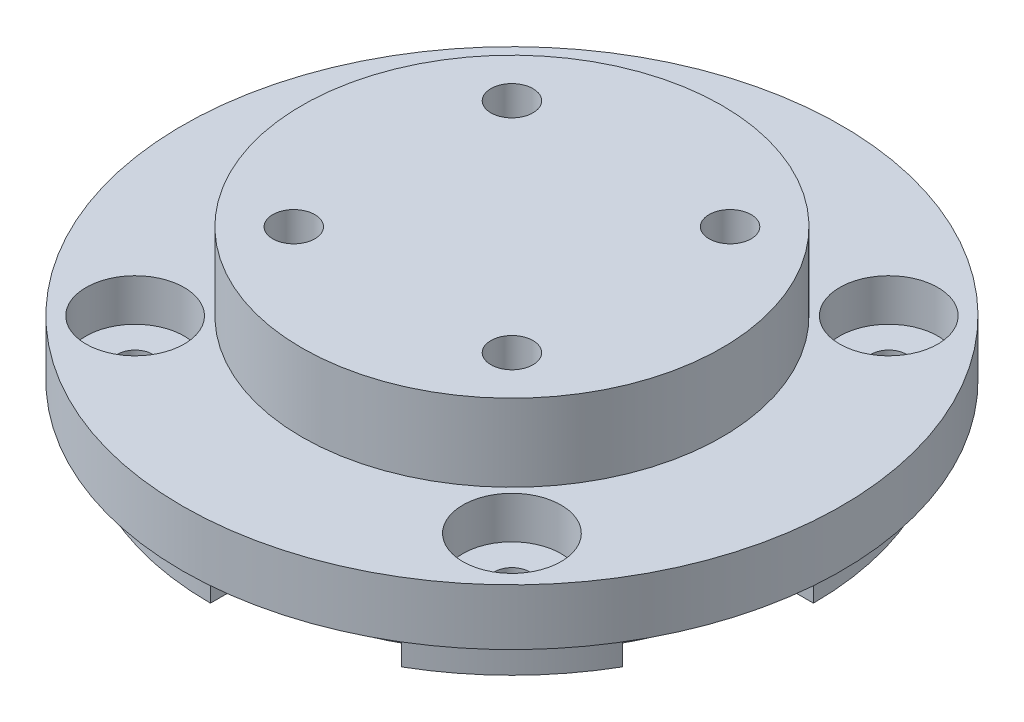
ISO-10303-21;
HEADER;
FILE_DESCRIPTION(('STEP AP214'),'2;1');
FILE_NAME('part.step','',(''),(''),'','','');
FILE_SCHEMA(('AUTOMOTIVE_DESIGN { 1 0 10303 214 1 1 1 1 }'));
ENDSEC;
DATA;
#1=APPLICATION_CONTEXT('core data for automotive mechanical design processes');
#2=APPLICATION_PROTOCOL_DEFINITION('international standard','automotive_design',2000,#1);
#3=PRODUCT_CONTEXT('',#1,'mechanical');
#4=PRODUCT('Part','Part','',(#3));
#5=PRODUCT_RELATED_PRODUCT_CATEGORY('part','',(#4));
#6=PRODUCT_DEFINITION_FORMATION('','',#4);
#7=PRODUCT_DEFINITION_CONTEXT('part definition',#1,'design');
#8=PRODUCT_DEFINITION('design','',#6,#7);
#9=PRODUCT_DEFINITION_SHAPE('','',#8);
#10=(LENGTH_UNIT() NAMED_UNIT(*) SI_UNIT(.MILLI.,.METRE.));
#11=(NAMED_UNIT(*) PLANE_ANGLE_UNIT() SI_UNIT($,.RADIAN.));
#12=(NAMED_UNIT(*) SI_UNIT($,.STERADIAN.) SOLID_ANGLE_UNIT());
#13=UNCERTAINTY_MEASURE_WITH_UNIT(LENGTH_MEASURE(1.E-05),#10,'distance_accuracy_value','');
#14=(GEOMETRIC_REPRESENTATION_CONTEXT(3) GLOBAL_UNCERTAINTY_ASSIGNED_CONTEXT((#13)) GLOBAL_UNIT_ASSIGNED_CONTEXT((#10,
#11,#12)) REPRESENTATION_CONTEXT('',''));
#15=CARTESIAN_POINT('',(0.,0.,0.));
#16=DIRECTION('',(0.,0.,1.));
#17=DIRECTION('',(1.,0.,0.));
#18=AXIS2_PLACEMENT_3D('',#15,#16,#17);
#19=CARTESIAN_POINT('',(0.,7.,0.));
#20=DIRECTION('',(0.,-1.,0.));
#21=DIRECTION('',(0.,0.,-1.));
#22=AXIS2_PLACEMENT_3D('',#19,#20,#21);
#23=CYLINDRICAL_SURFACE('',#22,21.5);
#24=DIRECTION('',(0.,-1.,0.));
#25=VECTOR('',#24,1.);
#26=CARTESIAN_POINT('',(18.6195461813654,14.6977646978707,10.75));
#27=LINE('',#26,#25);
#28=CARTESIAN_POINT('',(18.6195461813654,3.,10.75));
#29=VERTEX_POINT('',#28);
#30=CARTESIAN_POINT('',(18.6195461813654,0.,10.75));
#31=VERTEX_POINT('',#30);
#32=EDGE_CURVE('E122',#29,#31,#27,.T.);
#33=ORIENTED_EDGE('',*,*,#32,.F.);
#34=CARTESIAN_POINT('',(0.,3.,0.));
#35=DIRECTION('',(0.,1.,0.));
#36=DIRECTION('',(0.,0.,1.));
#37=AXIS2_PLACEMENT_3D('',#34,#35,#36);
#38=CIRCLE('',#37,21.5);
#39=CARTESIAN_POINT('',(10.7499999999999,3.,18.6195461813655));
#40=VERTEX_POINT('',#39);
#41=EDGE_CURVE('E11',#40,#29,#38,.T.);
#42=ORIENTED_EDGE('',*,*,#41,.F.);
#43=DIRECTION('',(0.,-1.,0.));
#44=VECTOR('',#43,1.);
#45=CARTESIAN_POINT('',(10.7499999999999,14.6977646978707,18.6195461813655));
#46=LINE('',#45,#44);
#47=CARTESIAN_POINT('',(10.7499999999999,0.,18.6195461813655));
#48=VERTEX_POINT('',#47);
#49=EDGE_CURVE('E158',#40,#48,#46,.T.);
#50=ORIENTED_EDGE('',*,*,#49,.T.);
#51=CARTESIAN_POINT('',(0.,0.,0.));
#52=DIRECTION('',(0.,1.,0.));
#53=DIRECTION('',(0.,0.,1.));
#54=AXIS2_PLACEMENT_3D('',#51,#52,#53);
#55=CIRCLE('',#54,21.5);
#56=EDGE_CURVE('E222',#48,#31,#55,.T.);
#57=ORIENTED_EDGE('',*,*,#56,.T.);
#58=EDGE_LOOP('',(#33,#42,#50,#57));
#59=FACE_BOUND('',#58,.T.);
#60=ADVANCED_FACE('F43',(#59),#23,.T.);
#61=CARTESIAN_POINT('',(21.5,3.,0.));
#62=VERTEX_POINT('',#61);
#63=CARTESIAN_POINT('',(0.,3.,21.5));
#64=VERTEX_POINT('',#63);
#65=EDGE_CURVE('E51',#62,#64,#38,.T.);
#66=ORIENTED_EDGE('',*,*,#65,.F.);
#67=DIRECTION('',(0.,-1.,0.));
#68=VECTOR('',#67,1.);
#69=CARTESIAN_POINT('',(21.5,14.6977646978707,0.));
#70=LINE('',#69,#68);
#71=CARTESIAN_POINT('',(21.5,0.,0.));
#72=VERTEX_POINT('',#71);
#73=EDGE_CURVE('E141',#62,#72,#70,.T.);
#74=ORIENTED_EDGE('',*,*,#73,.T.);
#75=CARTESIAN_POINT('',(0.,0.,21.5));
#76=VERTEX_POINT('',#75);
#77=EDGE_CURVE('E218',#72,#76,#55,.T.);
#78=ORIENTED_EDGE('',*,*,#77,.T.);
#79=DIRECTION('',(0.,-1.,0.));
#80=VECTOR('',#79,1.);
#81=CARTESIAN_POINT('',(0.,14.6977646978707,21.5));
#82=LINE('',#81,#80);
#83=EDGE_CURVE('E153',#64,#76,#82,.T.);
#84=ORIENTED_EDGE('',*,*,#83,.F.);
#85=EDGE_LOOP('',(#66,#74,#78,#84));
#86=FACE_BOUND('',#85,.T.);
#87=ADVANCED_FACE('F249',(#86),#23,.T.);
#88=CARTESIAN_POINT('',(0.,0.,0.));
#89=DIRECTION('',(0.,1.,0.));
#90=DIRECTION('',(0.,0.,1.));
#91=AXIS2_PLACEMENT_3D('',#88,#89,#90);
#92=PLANE('',#91);
#93=CARTESIAN_POINT('',(0.,0.,0.));
#94=DIRECTION('',(0.,1.,0.));
#95=DIRECTION('',(0.,0.,1.));
#96=AXIS2_PLACEMENT_3D('',#93,#94,#95);
#97=CIRCLE('',#96,14.48);
#98=CARTESIAN_POINT('',(0.,0.,14.48));
#99=VERTEX_POINT('',#98);
#100=EDGE_CURVE('E565',#99,#99,#97,.T.);
#101=ORIENTED_EDGE('',*,*,#100,.T.);
#102=EDGE_LOOP('',(#101));
#103=FACE_BOUND('',#102,.T.);
#104=CARTESIAN_POINT('',(13.4350288425444,0.,-13.4350288425444));
#105=DIRECTION('',(0.,1.,0.));
#106=DIRECTION('',(0.,0.,1.));
#107=AXIS2_PLACEMENT_3D('',#104,#105,#106);
#108=CIRCLE('',#107,1.25);
#109=CARTESIAN_POINT('',(13.4350288425444,0.,-12.1850288425444));
#110=VERTEX_POINT('',#109);
#111=EDGE_CURVE('E198',#110,#110,#108,.T.);
#112=ORIENTED_EDGE('',*,*,#111,.T.);
#113=EDGE_LOOP('',(#112));
#114=FACE_BOUND('',#113,.T.);
#115=CARTESIAN_POINT('',(13.4350288425444,0.,13.4350288425444));
#116=DIRECTION('',(0.,1.,0.));
#117=DIRECTION('',(0.,0.,1.));
#118=AXIS2_PLACEMENT_3D('',#115,#116,#117);
#119=CIRCLE('',#118,1.25);
#120=CARTESIAN_POINT('',(13.4350288425444,0.,14.6850288425444));
#121=VERTEX_POINT('',#120);
#122=EDGE_CURVE('E207',#121,#121,#119,.T.);
#123=ORIENTED_EDGE('',*,*,#122,.T.);
#124=EDGE_LOOP('',(#123));
#125=FACE_BOUND('',#124,.T.);
#126=CARTESIAN_POINT('',(-13.4350288425444,0.,13.4350288425444));
#127=DIRECTION('',(0.,1.,0.));
#128=DIRECTION('',(0.,0.,1.));
#129=AXIS2_PLACEMENT_3D('',#126,#127,#128);
#130=CIRCLE('',#129,1.25);
#131=CARTESIAN_POINT('',(-13.4350288425444,0.,14.6850288425444));
#132=VERTEX_POINT('',#131);
#133=EDGE_CURVE('E209',#132,#132,#130,.T.);
#134=ORIENTED_EDGE('',*,*,#133,.T.);
#135=EDGE_LOOP('',(#134));
#136=FACE_BOUND('',#135,.T.);
#137=CARTESIAN_POINT('',(-13.4350288425444,0.,-13.4350288425444));
#138=DIRECTION('',(0.,1.,0.));
#139=DIRECTION('',(0.,0.,1.));
#140=AXIS2_PLACEMENT_3D('',#137,#138,#139);
#141=CIRCLE('',#140,1.25);
#142=CARTESIAN_POINT('',(-13.4350288425444,0.,-12.1850288425444));
#143=VERTEX_POINT('',#142);
#144=EDGE_CURVE('E215',#143,#143,#141,.T.);
#145=ORIENTED_EDGE('',*,*,#144,.T.);
#146=EDGE_LOOP('',(#145));
#147=FACE_BOUND('',#146,.T.);
#148=ORIENTED_EDGE('',*,*,#77,.F.);
#149=DIRECTION('',(1.,0.,0.));
#150=VECTOR('',#149,1.);
#151=CARTESIAN_POINT('',(0.,0.,0.));
#152=LINE('',#151,#150);
#153=CARTESIAN_POINT('',(19.5,0.,0.));
#154=VERTEX_POINT('',#153);
#155=EDGE_CURVE('E135',#154,#72,#152,.T.);
#156=ORIENTED_EDGE('',*,*,#155,.F.);
#157=CARTESIAN_POINT('',(0.,0.,0.));
#158=DIRECTION('',(0.,-1.,0.));
#159=DIRECTION('',(0.,0.,-1.));
#160=AXIS2_PLACEMENT_3D('',#157,#158,#159);
#161=CIRCLE('',#160,19.5);
#162=CARTESIAN_POINT('',(16.8874953737965,0.,9.75000000000002));
#163=VERTEX_POINT('',#162);
#164=EDGE_CURVE('E114',#154,#163,#161,.T.);
#165=ORIENTED_EDGE('',*,*,#164,.T.);
#166=DIRECTION('',(0.866025403784438,0.,0.500000000000001));
#167=VECTOR('',#166,1.);
#168=CARTESIAN_POINT('',(0.,0.,0.));
#169=LINE('',#168,#167);
#170=EDGE_CURVE('E119',#163,#31,#169,.T.);
#171=ORIENTED_EDGE('',*,*,#170,.T.);
#172=ORIENTED_EDGE('',*,*,#56,.F.);
#173=DIRECTION('',(-0.499999999999995,0.,-0.866025403784442));
#174=VECTOR('',#173,1.);
#175=CARTESIAN_POINT('',(0.,0.,0.));
#176=LINE('',#175,#174);
#177=CARTESIAN_POINT('',(9.7499999999999,0.,16.8874953737966));
#178=VERTEX_POINT('',#177);
#179=EDGE_CURVE('E156',#48,#178,#176,.T.);
#180=ORIENTED_EDGE('',*,*,#179,.T.);
#181=CARTESIAN_POINT('',(0.,0.,0.));
#182=DIRECTION('',(0.,-1.,0.));
#183=DIRECTION('',(0.,0.,-1.));
#184=AXIS2_PLACEMENT_3D('',#181,#182,#183);
#185=CIRCLE('',#184,19.5);
#186=CARTESIAN_POINT('',(0.,0.,19.5));
#187=VERTEX_POINT('',#186);
#188=EDGE_CURVE('E159',#178,#187,#185,.T.);
#189=ORIENTED_EDGE('',*,*,#188,.T.);
#190=DIRECTION('',(0.,0.,1.));
#191=VECTOR('',#190,1.);
#192=CARTESIAN_POINT('',(0.,0.,0.));
#193=LINE('',#192,#191);
#194=EDGE_CURVE('E154',#187,#76,#193,.T.);
#195=ORIENTED_EDGE('',*,*,#194,.T.);
#196=EDGE_LOOP('',(#148,#156,#165,#171,#172,#180,#189,#195));
#197=FACE_BOUND('',#196,.T.);
#198=ADVANCED_FACE('F131',(#103,#114,#125,#136,#147,#197),#92,.F.);
#199=CARTESIAN_POINT('',(13.4350288425444,-8.,-13.4350288425444));
#200=DIRECTION('',(0.,1.,0.));
#201=DIRECTION('',(0.,0.,1.));
#202=AXIS2_PLACEMENT_3D('',#199,#200,#201);
#203=CYLINDRICAL_SURFACE('',#202,1.25);
#204=ORIENTED_EDGE('',*,*,#111,.F.);
#205=EDGE_LOOP('',(#204));
#206=FACE_BOUND('',#205,.T.);
#207=CARTESIAN_POINT('',(13.4350288425444,4.,-13.4350288425444));
#208=DIRECTION('',(0.,1.,0.));
#209=DIRECTION('',(0.,0.,1.));
#210=AXIS2_PLACEMENT_3D('',#207,#208,#209);
#211=CIRCLE('',#210,1.25);
#212=CARTESIAN_POINT('',(13.4350288425444,4.,-12.1850288425444));
#213=VERTEX_POINT('',#212);
#214=EDGE_CURVE('E202',#213,#213,#211,.F.);
#215=ORIENTED_EDGE('',*,*,#214,.F.);
#216=EDGE_LOOP('',(#215));
#217=FACE_BOUND('',#216,.T.);
#218=ADVANCED_FACE('F240',(#206,#217),#203,.F.);
#219=CARTESIAN_POINT('',(13.4350288425444,-8.,13.4350288425444));
#220=DIRECTION('',(0.,1.,0.));
#221=DIRECTION('',(0.,0.,1.));
#222=AXIS2_PLACEMENT_3D('',#219,#220,#221);
#223=CYLINDRICAL_SURFACE('',#222,1.25);
#224=ORIENTED_EDGE('',*,*,#122,.F.);
#225=EDGE_LOOP('',(#224));
#226=FACE_BOUND('',#225,.T.);
#227=CARTESIAN_POINT('',(13.4350288425444,4.,13.4350288425444));
#228=DIRECTION('',(0.,1.,0.));
#229=DIRECTION('',(0.,0.,1.));
#230=AXIS2_PLACEMENT_3D('',#227,#228,#229);
#231=CIRCLE('',#230,1.25);
#232=CARTESIAN_POINT('',(13.4350288425444,4.,14.6850288425444));
#233=VERTEX_POINT('',#232);
#234=EDGE_CURVE('E229',#233,#233,#231,.F.);
#235=ORIENTED_EDGE('',*,*,#234,.F.);
#236=EDGE_LOOP('',(#235));
#237=FACE_BOUND('',#236,.T.);
#238=ADVANCED_FACE('F237',(#226,#237),#223,.F.);
#239=CARTESIAN_POINT('',(-13.4350288425444,-8.,13.4350288425444));
#240=DIRECTION('',(0.,1.,0.));
#241=DIRECTION('',(0.,0.,1.));
#242=AXIS2_PLACEMENT_3D('',#239,#240,#241);
#243=CYLINDRICAL_SURFACE('',#242,1.25);
#244=ORIENTED_EDGE('',*,*,#133,.F.);
#245=EDGE_LOOP('',(#244));
#246=FACE_BOUND('',#245,.T.);
#247=CARTESIAN_POINT('',(-13.4350288425444,4.,13.4350288425444));
#248=DIRECTION('',(0.,1.,0.));
#249=DIRECTION('',(0.,0.,1.));
#250=AXIS2_PLACEMENT_3D('',#247,#248,#249);
#251=CIRCLE('',#250,1.25);
#252=CARTESIAN_POINT('',(-13.4350288425444,4.,14.6850288425444));
#253=VERTEX_POINT('',#252);
#254=EDGE_CURVE('E227',#253,#253,#251,.F.);
#255=ORIENTED_EDGE('',*,*,#254,.F.);
#256=EDGE_LOOP('',(#255));
#257=FACE_BOUND('',#256,.T.);
#258=ADVANCED_FACE('F246',(#246,#257),#243,.F.);
#259=CARTESIAN_POINT('',(-13.4350288425444,-8.,-13.4350288425444));
#260=DIRECTION('',(0.,1.,0.));
#261=DIRECTION('',(0.,0.,1.));
#262=AXIS2_PLACEMENT_3D('',#259,#260,#261);
#263=CYLINDRICAL_SURFACE('',#262,1.25);
#264=ORIENTED_EDGE('',*,*,#144,.F.);
#265=EDGE_LOOP('',(#264));
#266=FACE_BOUND('',#265,.T.);
#267=CARTESIAN_POINT('',(-13.4350288425444,4.,-13.4350288425444));
#268=DIRECTION('',(0.,1.,0.));
#269=DIRECTION('',(0.,0.,1.));
#270=AXIS2_PLACEMENT_3D('',#267,#268,#269);
#271=CIRCLE('',#270,1.25);
#272=CARTESIAN_POINT('',(-13.4350288425444,4.,-12.1850288425444));
#273=VERTEX_POINT('',#272);
#274=EDGE_CURVE('E192',#273,#273,#271,.F.);
#275=ORIENTED_EDGE('',*,*,#274,.F.);
#276=EDGE_LOOP('',(#275));
#277=FACE_BOUND('',#276,.T.);
#278=ADVANCED_FACE('F328',(#266,#277),#263,.F.);
#279=CARTESIAN_POINT('',(0.,3.,0.));
#280=DIRECTION('',(0.,1.,0.));
#281=DIRECTION('',(0.,0.,1.));
#282=AXIS2_PLACEMENT_3D('',#279,#280,#281);
#283=CYLINDRICAL_SURFACE('',#282,23.5);
#284=CARTESIAN_POINT('',(0.,3.,0.));
#285=DIRECTION('',(0.,1.,0.));
#286=DIRECTION('',(0.,0.,1.));
#287=AXIS2_PLACEMENT_3D('',#284,#285,#286);
#288=CIRCLE('',#287,23.5);
#289=CARTESIAN_POINT('',(0.,3.,23.5));
#290=VERTEX_POINT('',#289);
#291=EDGE_CURVE('E219',#290,#290,#288,.T.);
#292=ORIENTED_EDGE('',*,*,#291,.T.);
#293=EDGE_LOOP('',(#292));
#294=FACE_BOUND('',#293,.T.);
#295=CARTESIAN_POINT('',(0.,7.,0.));
#296=DIRECTION('',(0.,1.,0.));
#297=DIRECTION('',(0.,0.,1.));
#298=AXIS2_PLACEMENT_3D('',#295,#296,#297);
#299=CIRCLE('',#298,23.5);
#300=CARTESIAN_POINT('',(0.,7.,23.5));
#301=VERTEX_POINT('',#300);
#302=EDGE_CURVE('E214',#301,#301,#299,.T.);
#303=ORIENTED_EDGE('',*,*,#302,.F.);
#304=EDGE_LOOP('',(#303));
#305=FACE_BOUND('',#304,.T.);
#306=ADVANCED_FACE('F335',(#294,#305),#283,.T.);
#307=CARTESIAN_POINT('',(0.,3.,0.));
#308=DIRECTION('',(0.,1.,0.));
#309=DIRECTION('',(0.,0.,1.));
#310=AXIS2_PLACEMENT_3D('',#307,#308,#309);
#311=PLANE('',#310);
#312=ORIENTED_EDGE('',*,*,#65,.T.);
#313=DIRECTION('',(0.,0.,1.));
#314=VECTOR('',#313,1.);
#315=CARTESIAN_POINT('',(0.,3.,0.));
#316=LINE('',#315,#314);
#317=CARTESIAN_POINT('',(0.,3.,19.5));
#318=VERTEX_POINT('',#317);
#319=EDGE_CURVE('E146',#318,#64,#316,.T.);
#320=ORIENTED_EDGE('',*,*,#319,.F.);
#321=CARTESIAN_POINT('',(0.,3.,0.));
#322=DIRECTION('',(0.,1.,0.));
#323=DIRECTION('',(0.,0.,1.));
#324=AXIS2_PLACEMENT_3D('',#321,#322,#323);
#325=CIRCLE('',#324,19.5);
#326=CARTESIAN_POINT('',(9.7499999999999,3.,16.8874953737966));
#327=VERTEX_POINT('',#326);
#328=EDGE_CURVE('E164',#327,#318,#325,.F.);
#329=ORIENTED_EDGE('',*,*,#328,.F.);
#330=DIRECTION('',(-0.499999999999995,0.,-0.866025403784442));
#331=VECTOR('',#330,1.);
#332=CARTESIAN_POINT('',(0.,3.,0.));
#333=LINE('',#332,#331);
#334=EDGE_CURVE('E64',#40,#327,#333,.T.);
#335=ORIENTED_EDGE('',*,*,#334,.F.);
#336=ORIENTED_EDGE('',*,*,#41,.T.);
#337=DIRECTION('',(0.866025403784438,0.,0.500000000000001));
#338=VECTOR('',#337,1.);
#339=CARTESIAN_POINT('',(0.,3.,0.));
#340=LINE('',#339,#338);
#341=CARTESIAN_POINT('',(16.8874953737965,3.,9.75000000000002));
#342=VERTEX_POINT('',#341);
#343=EDGE_CURVE('E143',#342,#29,#340,.T.);
#344=ORIENTED_EDGE('',*,*,#343,.F.);
#345=CARTESIAN_POINT('',(0.,3.,0.));
#346=DIRECTION('',(0.,1.,0.));
#347=DIRECTION('',(0.,0.,1.));
#348=AXIS2_PLACEMENT_3D('',#345,#346,#347);
#349=CIRCLE('',#348,19.5);
#350=CARTESIAN_POINT('',(19.5,3.,0.));
#351=VERTEX_POINT('',#350);
#352=EDGE_CURVE('E120',#351,#342,#349,.F.);
#353=ORIENTED_EDGE('',*,*,#352,.F.);
#354=DIRECTION('',(1.,0.,0.));
#355=VECTOR('',#354,1.);
#356=CARTESIAN_POINT('',(0.,3.,0.));
#357=LINE('',#356,#355);
#358=EDGE_CURVE('E56',#351,#62,#357,.T.);
#359=ORIENTED_EDGE('',*,*,#358,.T.);
#360=EDGE_LOOP('',(#312,#320,#329,#335,#336,#344,#353,#359));
#361=FACE_BOUND('',#360,.T.);
#362=ORIENTED_EDGE('',*,*,#291,.F.);
#363=EDGE_LOOP('',(#362));
#364=FACE_BOUND('',#363,.T.);
#365=ADVANCED_FACE('F265',(#361,#364),#311,.F.);
#366=CARTESIAN_POINT('',(0.,7.,0.));
#367=DIRECTION('',(0.,1.,0.));
#368=DIRECTION('',(0.,0.,1.));
#369=AXIS2_PLACEMENT_3D('',#366,#367,#368);
#370=PLANE('',#369);
#371=CARTESIAN_POINT('',(-13.4350288425445,7.,13.4350288425443));
#372=DIRECTION('',(0.,1.,0.));
#373=DIRECTION('',(0.,0.,1.));
#374=AXIS2_PLACEMENT_3D('',#371,#372,#373);
#375=CIRCLE('',#374,3.5);
#376=CARTESIAN_POINT('',(-13.4350288425445,7.,16.9350288425443));
#377=VERTEX_POINT('',#376);
#378=EDGE_CURVE('E140',#377,#377,#375,.T.);
#379=ORIENTED_EDGE('',*,*,#378,.F.);
#380=EDGE_LOOP('',(#379));
#381=FACE_BOUND('',#380,.T.);
#382=CARTESIAN_POINT('',(13.4350288425443,7.,13.4350288425445));
#383=DIRECTION('',(0.,1.,0.));
#384=DIRECTION('',(0.,0.,1.));
#385=AXIS2_PLACEMENT_3D('',#382,#383,#384);
#386=CIRCLE('',#385,3.5);
#387=CARTESIAN_POINT('',(13.4350288425443,7.,16.9350288425445));
#388=VERTEX_POINT('',#387);
#389=EDGE_CURVE('E185',#388,#388,#386,.T.);
#390=ORIENTED_EDGE('',*,*,#389,.F.);
#391=EDGE_LOOP('',(#390));
#392=FACE_BOUND('',#391,.T.);
#393=CARTESIAN_POINT('',(13.4350288425444,7.,-13.4350288425444));
#394=DIRECTION('',(0.,1.,0.));
#395=DIRECTION('',(0.,0.,1.));
#396=AXIS2_PLACEMENT_3D('',#393,#394,#395);
#397=CIRCLE('',#396,3.5);
#398=CARTESIAN_POINT('',(13.4350288425444,7.,-9.93502884254435));
#399=VERTEX_POINT('',#398);
#400=EDGE_CURVE('E174',#399,#399,#397,.T.);
#401=ORIENTED_EDGE('',*,*,#400,.F.);
#402=EDGE_LOOP('',(#401));
#403=FACE_BOUND('',#402,.T.);
#404=CARTESIAN_POINT('',(-13.4350288425444,7.,-13.4350288425444));
#405=DIRECTION('',(0.,1.,0.));
#406=DIRECTION('',(0.,0.,1.));
#407=AXIS2_PLACEMENT_3D('',#404,#405,#406);
#408=CIRCLE('',#407,3.5);
#409=CARTESIAN_POINT('',(-13.4350288425444,7.,-9.9350288425444));
#410=VERTEX_POINT('',#409);
#411=EDGE_CURVE('E178',#410,#410,#408,.T.);
#412=ORIENTED_EDGE('',*,*,#411,.F.);
#413=EDGE_LOOP('',(#412));
#414=FACE_BOUND('',#413,.T.);
#415=CARTESIAN_POINT('',(0.,7.,0.));
#416=DIRECTION('',(0.,1.,0.));
#417=DIRECTION('',(0.,0.,1.));
#418=AXIS2_PLACEMENT_3D('',#415,#416,#417);
#419=CIRCLE('',#418,14.98);
#420=CARTESIAN_POINT('',(0.,7.,14.98));
#421=VERTEX_POINT('',#420);
#422=EDGE_CURVE('E197',#421,#421,#419,.T.);
#423=ORIENTED_EDGE('',*,*,#422,.F.);
#424=EDGE_LOOP('',(#423));
#425=FACE_BOUND('',#424,.T.);
#426=ORIENTED_EDGE('',*,*,#302,.T.);
#427=EDGE_LOOP('',(#426));
#428=FACE_BOUND('',#427,.T.);
#429=ADVANCED_FACE('F323',(#381,#392,#403,#414,#425,#428),#370,.T.);
#430=CARTESIAN_POINT('',(0.,12.5,0.));
#431=DIRECTION('',(0.,1.,0.));
#432=DIRECTION('',(0.,0.,1.));
#433=AXIS2_PLACEMENT_3D('',#430,#431,#432);
#434=PLANE('',#433);
#435=CARTESIAN_POINT('',(0.,12.5,0.));
#436=DIRECTION('',(0.,1.,0.));
#437=DIRECTION('',(0.,0.,1.));
#438=AXIS2_PLACEMENT_3D('',#435,#436,#437);
#439=CIRCLE('',#438,14.98);
#440=CARTESIAN_POINT('',(0.,12.5,14.98));
#441=VERTEX_POINT('',#440);
#442=EDGE_CURVE('E199',#441,#441,#439,.T.);
#443=ORIENTED_EDGE('',*,*,#442,.T.);
#444=EDGE_LOOP('',(#443));
#445=FACE_BOUND('',#444,.T.);
#446=CARTESIAN_POINT('',(-7.77817459305202,12.5,7.77817459305202));
#447=DIRECTION('',(0.,1.,0.));
#448=DIRECTION('',(0.,0.,1.));
#449=AXIS2_PLACEMENT_3D('',#446,#447,#448);
#450=CIRCLE('',#449,1.5);
#451=CARTESIAN_POINT('',(-7.77817459305202,12.5,9.27817459305202));
#452=VERTEX_POINT('',#451);
#453=EDGE_CURVE('E572',#452,#452,#450,.T.);
#454=ORIENTED_EDGE('',*,*,#453,.F.);
#455=EDGE_LOOP('',(#454));
#456=FACE_BOUND('',#455,.T.);
#457=CARTESIAN_POINT('',(7.77817459305202,12.5,-7.77817459305202));
#458=DIRECTION('',(0.,1.,0.));
#459=DIRECTION('',(0.,0.,1.));
#460=AXIS2_PLACEMENT_3D('',#457,#458,#459);
#461=CIRCLE('',#460,1.5);
#462=CARTESIAN_POINT('',(7.77817459305202,12.5,-6.27817459305202));
#463=VERTEX_POINT('',#462);
#464=EDGE_CURVE('E172',#463,#463,#461,.T.);
#465=ORIENTED_EDGE('',*,*,#464,.F.);
#466=EDGE_LOOP('',(#465));
#467=FACE_BOUND('',#466,.T.);
#468=CARTESIAN_POINT('',(7.77817459305202,12.5,7.77817459305202));
#469=DIRECTION('',(0.,1.,0.));
#470=DIRECTION('',(0.,0.,1.));
#471=AXIS2_PLACEMENT_3D('',#468,#469,#470);
#472=CIRCLE('',#471,1.5);
#473=CARTESIAN_POINT('',(7.77817459305202,12.5,9.27817459305202));
#474=VERTEX_POINT('',#473);
#475=EDGE_CURVE('E577',#474,#474,#472,.T.);
#476=ORIENTED_EDGE('',*,*,#475,.F.);
#477=EDGE_LOOP('',(#476));
#478=FACE_BOUND('',#477,.T.);
#479=CARTESIAN_POINT('',(-7.77817459305202,12.5,-7.77817459305202));
#480=DIRECTION('',(0.,1.,0.));
#481=DIRECTION('',(0.,0.,1.));
#482=AXIS2_PLACEMENT_3D('',#479,#480,#481);
#483=CIRCLE('',#482,1.5);
#484=CARTESIAN_POINT('',(-7.77817459305202,12.5,-6.27817459305202));
#485=VERTEX_POINT('',#484);
#486=EDGE_CURVE('E569',#485,#485,#483,.T.);
#487=ORIENTED_EDGE('',*,*,#486,.F.);
#488=EDGE_LOOP('',(#487));
#489=FACE_BOUND('',#488,.T.);
#490=ADVANCED_FACE('F321',(#445,#456,#467,#478,#489),#434,.T.);
#491=CARTESIAN_POINT('',(0.,12.5,0.));
#492=DIRECTION('',(0.,-1.,0.));
#493=DIRECTION('',(0.,0.,-1.));
#494=AXIS2_PLACEMENT_3D('',#491,#492,#493);
#495=CYLINDRICAL_SURFACE('',#494,14.98);
#496=ORIENTED_EDGE('',*,*,#442,.F.);
#497=EDGE_LOOP('',(#496));
#498=FACE_BOUND('',#497,.T.);
#499=ORIENTED_EDGE('',*,*,#422,.T.);
#500=EDGE_LOOP('',(#499));
#501=FACE_BOUND('',#500,.T.);
#502=ADVANCED_FACE('F317',(#498,#501),#495,.T.);
#503=CARTESIAN_POINT('',(-13.4350288425444,4.,-13.4350288425444));
#504=DIRECTION('',(0.,1.,0.));
#505=DIRECTION('',(0.,0.,1.));
#506=AXIS2_PLACEMENT_3D('',#503,#504,#505);
#507=PLANE('',#506);
#508=CARTESIAN_POINT('',(-13.4350288425444,4.,-13.4350288425444));
#509=DIRECTION('',(0.,1.,0.));
#510=DIRECTION('',(0.,0.,1.));
#511=AXIS2_PLACEMENT_3D('',#508,#509,#510);
#512=CIRCLE('',#511,3.5);
#513=CARTESIAN_POINT('',(-13.4350288425444,4.,-9.9350288425444));
#514=VERTEX_POINT('',#513);
#515=EDGE_CURVE('E188',#514,#514,#512,.T.);
#516=ORIENTED_EDGE('',*,*,#515,.T.);
#517=EDGE_LOOP('',(#516));
#518=FACE_BOUND('',#517,.T.);
#519=ORIENTED_EDGE('',*,*,#274,.T.);
#520=EDGE_LOOP('',(#519));
#521=FACE_BOUND('',#520,.T.);
#522=ADVANCED_FACE('F312',(#518,#521),#507,.T.);
#523=CARTESIAN_POINT('',(-13.4350288425444,4.,-13.4350288425444));
#524=DIRECTION('',(0.,1.,0.));
#525=DIRECTION('',(0.,0.,1.));
#526=AXIS2_PLACEMENT_3D('',#523,#524,#525);
#527=CYLINDRICAL_SURFACE('',#526,3.5);
#528=ORIENTED_EDGE('',*,*,#515,.F.);
#529=EDGE_LOOP('',(#528));
#530=FACE_BOUND('',#529,.T.);
#531=ORIENTED_EDGE('',*,*,#411,.T.);
#532=EDGE_LOOP('',(#531));
#533=FACE_BOUND('',#532,.T.);
#534=ADVANCED_FACE('F311',(#530,#533),#527,.F.);
#535=CARTESIAN_POINT('',(-13.4350288425445,4.,13.4350288425443));
#536=DIRECTION('',(0.,1.,0.));
#537=DIRECTION('',(0.,0.,1.));
#538=AXIS2_PLACEMENT_3D('',#535,#536,#537);
#539=PLANE('',#538);
#540=CARTESIAN_POINT('',(-13.4350288425445,4.,13.4350288425443));
#541=DIRECTION('',(0.,1.,0.));
#542=DIRECTION('',(0.,0.,1.));
#543=AXIS2_PLACEMENT_3D('',#540,#541,#542);
#544=CIRCLE('',#543,3.5);
#545=CARTESIAN_POINT('',(-13.4350288425445,4.,16.9350288425443));
#546=VERTEX_POINT('',#545);
#547=EDGE_CURVE('E133',#546,#546,#544,.T.);
#548=ORIENTED_EDGE('',*,*,#547,.T.);
#549=EDGE_LOOP('',(#548));
#550=FACE_BOUND('',#549,.T.);
#551=ORIENTED_EDGE('',*,*,#254,.T.);
#552=EDGE_LOOP('',(#551));
#553=FACE_BOUND('',#552,.T.);
#554=ADVANCED_FACE('F310',(#550,#553),#539,.T.);
#555=CARTESIAN_POINT('',(-13.4350288425445,4.,13.4350288425443));
#556=DIRECTION('',(0.,1.,0.));
#557=DIRECTION('',(0.,0.,1.));
#558=AXIS2_PLACEMENT_3D('',#555,#556,#557);
#559=CYLINDRICAL_SURFACE('',#558,3.5);
#560=ORIENTED_EDGE('',*,*,#547,.F.);
#561=EDGE_LOOP('',(#560));
#562=FACE_BOUND('',#561,.T.);
#563=ORIENTED_EDGE('',*,*,#378,.T.);
#564=EDGE_LOOP('',(#563));
#565=FACE_BOUND('',#564,.T.);
#566=ADVANCED_FACE('F303',(#562,#565),#559,.F.);
#567=CARTESIAN_POINT('',(13.4350288425443,4.,13.4350288425445));
#568=DIRECTION('',(0.,1.,0.));
#569=DIRECTION('',(0.,0.,1.));
#570=AXIS2_PLACEMENT_3D('',#567,#568,#569);
#571=PLANE('',#570);
#572=CARTESIAN_POINT('',(13.4350288425443,4.,13.4350288425445));
#573=DIRECTION('',(0.,1.,0.));
#574=DIRECTION('',(0.,0.,1.));
#575=AXIS2_PLACEMENT_3D('',#572,#573,#574);
#576=CIRCLE('',#575,3.5);
#577=CARTESIAN_POINT('',(13.4350288425443,4.,16.9350288425445));
#578=VERTEX_POINT('',#577);
#579=EDGE_CURVE('E184',#578,#578,#576,.T.);
#580=ORIENTED_EDGE('',*,*,#579,.T.);
#581=EDGE_LOOP('',(#580));
#582=FACE_BOUND('',#581,.T.);
#583=ORIENTED_EDGE('',*,*,#234,.T.);
#584=EDGE_LOOP('',(#583));
#585=FACE_BOUND('',#584,.T.);
#586=ADVANCED_FACE('F299',(#582,#585),#571,.T.);
#587=CARTESIAN_POINT('',(13.4350288425443,4.,13.4350288425445));
#588=DIRECTION('',(0.,1.,0.));
#589=DIRECTION('',(0.,0.,1.));
#590=AXIS2_PLACEMENT_3D('',#587,#588,#589);
#591=CYLINDRICAL_SURFACE('',#590,3.5);
#592=ORIENTED_EDGE('',*,*,#579,.F.);
#593=EDGE_LOOP('',(#592));
#594=FACE_BOUND('',#593,.T.);
#595=ORIENTED_EDGE('',*,*,#389,.T.);
#596=EDGE_LOOP('',(#595));
#597=FACE_BOUND('',#596,.T.);
#598=ADVANCED_FACE('F294',(#594,#597),#591,.F.);
#599=CARTESIAN_POINT('',(13.4350288425444,4.,-13.4350288425444));
#600=DIRECTION('',(0.,1.,0.));
#601=DIRECTION('',(0.,0.,1.));
#602=AXIS2_PLACEMENT_3D('',#599,#600,#601);
#603=PLANE('',#602);
#604=CARTESIAN_POINT('',(13.4350288425444,4.,-13.4350288425444));
#605=DIRECTION('',(0.,1.,0.));
#606=DIRECTION('',(0.,0.,1.));
#607=AXIS2_PLACEMENT_3D('',#604,#605,#606);
#608=CIRCLE('',#607,3.5);
#609=CARTESIAN_POINT('',(13.4350288425444,4.,-9.93502884254435));
#610=VERTEX_POINT('',#609);
#611=EDGE_CURVE('E177',#610,#610,#608,.T.);
#612=ORIENTED_EDGE('',*,*,#611,.T.);
#613=EDGE_LOOP('',(#612));
#614=FACE_BOUND('',#613,.T.);
#615=ORIENTED_EDGE('',*,*,#214,.T.);
#616=EDGE_LOOP('',(#615));
#617=FACE_BOUND('',#616,.T.);
#618=ADVANCED_FACE('F232',(#614,#617),#603,.T.);
#619=CARTESIAN_POINT('',(13.4350288425444,4.,-13.4350288425444));
#620=DIRECTION('',(0.,1.,0.));
#621=DIRECTION('',(0.,0.,1.));
#622=AXIS2_PLACEMENT_3D('',#619,#620,#621);
#623=CYLINDRICAL_SURFACE('',#622,3.5);
#624=ORIENTED_EDGE('',*,*,#611,.F.);
#625=EDGE_LOOP('',(#624));
#626=FACE_BOUND('',#625,.T.);
#627=ORIENTED_EDGE('',*,*,#400,.T.);
#628=EDGE_LOOP('',(#627));
#629=FACE_BOUND('',#628,.T.);
#630=ADVANCED_FACE('F289',(#626,#629),#623,.F.);
#631=CARTESIAN_POINT('',(0.,14.6977646978707,0.));
#632=DIRECTION('',(0.,-1.,0.));
#633=DIRECTION('',(0.,0.,-1.));
#634=AXIS2_PLACEMENT_3D('',#631,#632,#633);
#635=CYLINDRICAL_SURFACE('',#634,19.5);
#636=ORIENTED_EDGE('',*,*,#328,.T.);
#637=DIRECTION('',(0.,-1.,0.));
#638=VECTOR('',#637,1.);
#639=CARTESIAN_POINT('',(0.,14.6977646978707,19.5));
#640=LINE('',#639,#638);
#641=EDGE_CURVE('E152',#318,#187,#640,.T.);
#642=ORIENTED_EDGE('',*,*,#641,.T.);
#643=ORIENTED_EDGE('',*,*,#188,.F.);
#644=DIRECTION('',(0.,-1.,0.));
#645=VECTOR('',#644,1.);
#646=CARTESIAN_POINT('',(9.7499999999999,14.6977646978707,16.8874953737966));
#647=LINE('',#646,#645);
#648=EDGE_CURVE('E161',#327,#178,#647,.T.);
#649=ORIENTED_EDGE('',*,*,#648,.F.);
#650=EDGE_LOOP('',(#636,#642,#643,#649));
#651=FACE_BOUND('',#650,.T.);
#652=ADVANCED_FACE('F273',(#651),#635,.T.);
#653=CARTESIAN_POINT('',(0.,14.6977646978707,0.));
#654=DIRECTION('',(1.,0.,0.));
#655=DIRECTION('',(0.,0.,-1.));
#656=AXIS2_PLACEMENT_3D('',#653,#654,#655);
#657=PLANE('',#656);
#658=ORIENTED_EDGE('',*,*,#319,.T.);
#659=ORIENTED_EDGE('',*,*,#83,.T.);
#660=ORIENTED_EDGE('',*,*,#194,.F.);
#661=ORIENTED_EDGE('',*,*,#641,.F.);
#662=EDGE_LOOP('',(#658,#659,#660,#661));
#663=FACE_BOUND('',#662,.T.);
#664=ADVANCED_FACE('F275',(#663),#657,.T.);
#665=CARTESIAN_POINT('',(0.,14.6977646978707,0.));
#666=DIRECTION('',(-0.866025403784442,0.,0.499999999999995));
#667=DIRECTION('',(0.499999999999995,0.,0.866025403784442));
#668=AXIS2_PLACEMENT_3D('',#665,#666,#667);
#669=PLANE('',#668);
#670=ORIENTED_EDGE('',*,*,#334,.T.);
#671=ORIENTED_EDGE('',*,*,#648,.T.);
#672=ORIENTED_EDGE('',*,*,#179,.F.);
#673=ORIENTED_EDGE('',*,*,#49,.F.);
#674=EDGE_LOOP('',(#670,#671,#672,#673));
#675=FACE_BOUND('',#674,.T.);
#676=ADVANCED_FACE('F280',(#675),#669,.T.);
#677=CARTESIAN_POINT('',(0.,14.6977646978707,0.));
#678=DIRECTION('',(0.,0.,-1.));
#679=DIRECTION('',(-1.,0.,0.));
#680=AXIS2_PLACEMENT_3D('',#677,#678,#679);
#681=PLANE('',#680);
#682=DIRECTION('',(0.,-1.,0.));
#683=VECTOR('',#682,1.);
#684=CARTESIAN_POINT('',(19.5,14.6977646978707,0.));
#685=LINE('',#684,#683);
#686=EDGE_CURVE('E128',#351,#154,#685,.T.);
#687=ORIENTED_EDGE('',*,*,#686,.T.);
#688=ORIENTED_EDGE('',*,*,#155,.T.);
#689=ORIENTED_EDGE('',*,*,#73,.F.);
#690=ORIENTED_EDGE('',*,*,#358,.F.);
#691=EDGE_LOOP('',(#687,#688,#689,#690));
#692=FACE_BOUND('',#691,.T.);
#693=ADVANCED_FACE('F266',(#692),#681,.F.);
#694=CARTESIAN_POINT('',(0.,14.6977646978707,0.));
#695=DIRECTION('',(0.500000000000001,0.,-0.866025403784438));
#696=DIRECTION('',(-0.866025403784438,0.,-0.500000000000001));
#697=AXIS2_PLACEMENT_3D('',#694,#695,#696);
#698=PLANE('',#697);
#699=ORIENTED_EDGE('',*,*,#343,.T.);
#700=ORIENTED_EDGE('',*,*,#32,.T.);
#701=ORIENTED_EDGE('',*,*,#170,.F.);
#702=DIRECTION('',(0.,-1.,0.));
#703=VECTOR('',#702,1.);
#704=CARTESIAN_POINT('',(16.8874953737965,14.6977646978707,9.75000000000002));
#705=LINE('',#704,#703);
#706=EDGE_CURVE('E109',#342,#163,#705,.T.);
#707=ORIENTED_EDGE('',*,*,#706,.F.);
#708=EDGE_LOOP('',(#699,#700,#701,#707));
#709=FACE_BOUND('',#708,.T.);
#710=ADVANCED_FACE('F121',(#709),#698,.T.);
#711=CARTESIAN_POINT('',(0.,14.6977646978707,0.));
#712=DIRECTION('',(0.,-1.,0.));
#713=DIRECTION('',(0.,0.,-1.));
#714=AXIS2_PLACEMENT_3D('',#711,#712,#713);
#715=CYLINDRICAL_SURFACE('',#714,19.5);
#716=ORIENTED_EDGE('',*,*,#352,.T.);
#717=ORIENTED_EDGE('',*,*,#706,.T.);
#718=ORIENTED_EDGE('',*,*,#164,.F.);
#719=ORIENTED_EDGE('',*,*,#686,.F.);
#720=EDGE_LOOP('',(#716,#717,#718,#719));
#721=FACE_BOUND('',#720,.T.);
#722=ADVANCED_FACE('F115',(#721),#715,.T.);
#723=CARTESIAN_POINT('',(7.77817459305202,12.5,-7.77817459305202));
#724=DIRECTION('',(0.,-1.,0.));
#725=DIRECTION('',(0.,0.,-1.));
#726=AXIS2_PLACEMENT_3D('',#723,#724,#725);
#727=CYLINDRICAL_SURFACE('',#726,1.5);
#728=CARTESIAN_POINT('',(7.77817459305202,9.5,-7.77817459305202));
#729=DIRECTION('',(0.,1.,0.));
#730=DIRECTION('',(0.,0.,1.));
#731=AXIS2_PLACEMENT_3D('',#728,#729,#730);
#732=CIRCLE('',#731,1.5);
#733=CARTESIAN_POINT('',(7.77817459305202,9.5,-6.27817459305202));
#734=VERTEX_POINT('',#733);
#735=EDGE_CURVE('E546',#734,#734,#732,.T.);
#736=ORIENTED_EDGE('',*,*,#735,.F.);
#737=EDGE_LOOP('',(#736));
#738=FACE_BOUND('',#737,.T.);
#739=ORIENTED_EDGE('',*,*,#464,.T.);
#740=EDGE_LOOP('',(#739));
#741=FACE_BOUND('',#740,.T.);
#742=ADVANCED_FACE('F472',(#738,#741),#727,.F.);
#743=CARTESIAN_POINT('',(7.77817459305202,12.5,7.77817459305202));
#744=DIRECTION('',(0.,-1.,0.));
#745=DIRECTION('',(0.,0.,-1.));
#746=AXIS2_PLACEMENT_3D('',#743,#744,#745);
#747=CYLINDRICAL_SURFACE('',#746,1.5);
#748=CARTESIAN_POINT('',(7.77817459305202,9.5,7.77817459305202));
#749=DIRECTION('',(0.,1.,0.));
#750=DIRECTION('',(0.,0.,1.));
#751=AXIS2_PLACEMENT_3D('',#748,#749,#750);
#752=CIRCLE('',#751,1.5);
#753=CARTESIAN_POINT('',(7.77817459305202,9.5,9.27817459305202));
#754=VERTEX_POINT('',#753);
#755=EDGE_CURVE('E549',#754,#754,#752,.T.);
#756=ORIENTED_EDGE('',*,*,#755,.F.);
#757=EDGE_LOOP('',(#756));
#758=FACE_BOUND('',#757,.T.);
#759=ORIENTED_EDGE('',*,*,#475,.T.);
#760=EDGE_LOOP('',(#759));
#761=FACE_BOUND('',#760,.T.);
#762=ADVANCED_FACE('F489',(#758,#761),#747,.F.);
#763=CARTESIAN_POINT('',(-7.77817459305202,12.5,7.77817459305202));
#764=DIRECTION('',(0.,-1.,0.));
#765=DIRECTION('',(0.,0.,-1.));
#766=AXIS2_PLACEMENT_3D('',#763,#764,#765);
#767=CYLINDRICAL_SURFACE('',#766,1.5);
#768=CARTESIAN_POINT('',(-7.77817459305202,9.5,7.77817459305202));
#769=DIRECTION('',(0.,1.,0.));
#770=DIRECTION('',(0.,0.,1.));
#771=AXIS2_PLACEMENT_3D('',#768,#769,#770);
#772=CIRCLE('',#771,1.5);
#773=CARTESIAN_POINT('',(-7.77817459305202,9.5,9.27817459305202));
#774=VERTEX_POINT('',#773);
#775=EDGE_CURVE('E555',#774,#774,#772,.T.);
#776=ORIENTED_EDGE('',*,*,#775,.F.);
#777=EDGE_LOOP('',(#776));
#778=FACE_BOUND('',#777,.T.);
#779=ORIENTED_EDGE('',*,*,#453,.T.);
#780=EDGE_LOOP('',(#779));
#781=FACE_BOUND('',#780,.T.);
#782=ADVANCED_FACE('F499',(#778,#781),#767,.F.);
#783=CARTESIAN_POINT('',(-7.77817459305202,12.5,-7.77817459305202));
#784=DIRECTION('',(0.,-1.,0.));
#785=DIRECTION('',(0.,0.,-1.));
#786=AXIS2_PLACEMENT_3D('',#783,#784,#785);
#787=CYLINDRICAL_SURFACE('',#786,1.5);
#788=CARTESIAN_POINT('',(-7.77817459305202,9.5,-7.77817459305202));
#789=DIRECTION('',(0.,1.,0.));
#790=DIRECTION('',(0.,0.,1.));
#791=AXIS2_PLACEMENT_3D('',#788,#789,#790);
#792=CIRCLE('',#791,1.5);
#793=CARTESIAN_POINT('',(-7.77817459305202,9.5,-6.27817459305202));
#794=VERTEX_POINT('',#793);
#795=EDGE_CURVE('E46',#794,#794,#792,.T.);
#796=ORIENTED_EDGE('',*,*,#795,.F.);
#797=EDGE_LOOP('',(#796));
#798=FACE_BOUND('',#797,.T.);
#799=ORIENTED_EDGE('',*,*,#486,.T.);
#800=EDGE_LOOP('',(#799));
#801=FACE_BOUND('',#800,.T.);
#802=ADVANCED_FACE('F509',(#798,#801),#787,.F.);
#803=CARTESIAN_POINT('',(0.,0.,0.));
#804=DIRECTION('',(0.,1.,0.));
#805=DIRECTION('',(0.,0.,1.));
#806=AXIS2_PLACEMENT_3D('',#803,#804,#805);
#807=CYLINDRICAL_SURFACE('',#806,14.48);
#808=ORIENTED_EDGE('',*,*,#100,.F.);
#809=EDGE_LOOP('',(#808));
#810=FACE_BOUND('',#809,.T.);
#811=CARTESIAN_POINT('',(0.,9.5,0.));
#812=DIRECTION('',(0.,1.,0.));
#813=DIRECTION('',(0.,0.,1.));
#814=AXIS2_PLACEMENT_3D('',#811,#812,#813);
#815=CIRCLE('',#814,14.48);
#816=CARTESIAN_POINT('',(0.,9.5,14.48));
#817=VERTEX_POINT('',#816);
#818=EDGE_CURVE('E557',#817,#817,#815,.T.);
#819=ORIENTED_EDGE('',*,*,#818,.T.);
#820=EDGE_LOOP('',(#819));
#821=FACE_BOUND('',#820,.T.);
#822=ADVANCED_FACE('F519',(#810,#821),#807,.F.);
#823=CARTESIAN_POINT('',(0.,9.5,0.));
#824=DIRECTION('',(0.,1.,0.));
#825=DIRECTION('',(0.,0.,1.));
#826=AXIS2_PLACEMENT_3D('',#823,#824,#825);
#827=PLANE('',#826);
#828=ORIENTED_EDGE('',*,*,#735,.T.);
#829=EDGE_LOOP('',(#828));
#830=FACE_BOUND('',#829,.T.);
#831=ORIENTED_EDGE('',*,*,#755,.T.);
#832=EDGE_LOOP('',(#831));
#833=FACE_BOUND('',#832,.T.);
#834=ORIENTED_EDGE('',*,*,#775,.T.);
#835=EDGE_LOOP('',(#834));
#836=FACE_BOUND('',#835,.T.);
#837=ORIENTED_EDGE('',*,*,#795,.T.);
#838=EDGE_LOOP('',(#837));
#839=FACE_BOUND('',#838,.T.);
#840=ORIENTED_EDGE('',*,*,#818,.F.);
#841=EDGE_LOOP('',(#840));
#842=FACE_BOUND('',#841,.T.);
#843=ADVANCED_FACE('F529',(#830,#833,#836,#839,#842),#827,.F.);
#844=CLOSED_SHELL('',(#60,#87,#198,#218,#238,#258,#278,#306,#365,#429,#490,#502,#522,#534,#554,
#566,#586,#598,#618,#630,#652,#664,#676,#693,#710,#722,#742,#762,#782,#802,#822,#843));
#845=MANIFOLD_SOLID_BREP('B2',#844);
#846=ADVANCED_BREP_SHAPE_REPRESENTATION('',(#18,#845),#14);
#847=SHAPE_DEFINITION_REPRESENTATION(#9,#846);
ENDSEC;
END-ISO-10303-21;
